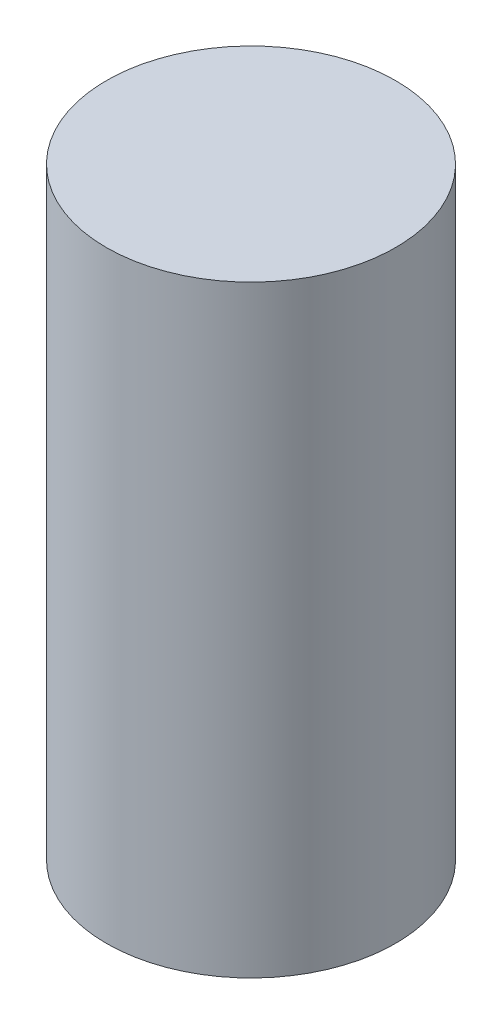
ISO-10303-21;
HEADER;
FILE_DESCRIPTION(('STEP AP214'),'2;1');
FILE_NAME('part.step','',(''),(''),'','','');
FILE_SCHEMA(('AUTOMOTIVE_DESIGN { 1 0 10303 214 1 1 1 1 }'));
ENDSEC;
DATA;
#1=APPLICATION_CONTEXT('core data for automotive mechanical design processes');
#2=APPLICATION_PROTOCOL_DEFINITION('international standard','automotive_design',2000,#1);
#3=PRODUCT_CONTEXT('',#1,'mechanical');
#4=PRODUCT('Part','Part','',(#3));
#5=PRODUCT_RELATED_PRODUCT_CATEGORY('part','',(#4));
#6=PRODUCT_DEFINITION_FORMATION('','',#4);
#7=PRODUCT_DEFINITION_CONTEXT('part definition',#1,'design');
#8=PRODUCT_DEFINITION('design','',#6,#7);
#9=PRODUCT_DEFINITION_SHAPE('','',#8);
#10=(LENGTH_UNIT() NAMED_UNIT(*) SI_UNIT(.MILLI.,.METRE.));
#11=(NAMED_UNIT(*) PLANE_ANGLE_UNIT() SI_UNIT($,.RADIAN.));
#12=(NAMED_UNIT(*) SI_UNIT($,.STERADIAN.) SOLID_ANGLE_UNIT());
#13=UNCERTAINTY_MEASURE_WITH_UNIT(LENGTH_MEASURE(1.E-05),#10,'distance_accuracy_value','');
#14=(GEOMETRIC_REPRESENTATION_CONTEXT(3) GLOBAL_UNCERTAINTY_ASSIGNED_CONTEXT((#13)) GLOBAL_UNIT_ASSIGNED_CONTEXT((#10,
#11,#12)) REPRESENTATION_CONTEXT('',''));
#15=CARTESIAN_POINT('',(0.,0.,0.));
#16=DIRECTION('',(0.,0.,1.));
#17=DIRECTION('',(1.,0.,0.));
#18=AXIS2_PLACEMENT_3D('',#15,#16,#17);
#19=CARTESIAN_POINT('',(0.,25.,0.));
#20=DIRECTION('',(0.,-1.,0.));
#21=DIRECTION('',(0.,0.,-1.));
#22=AXIS2_PLACEMENT_3D('',#19,#20,#21);
#23=CYLINDRICAL_SURFACE('',#22,6.);
#24=CARTESIAN_POINT('',(0.,25.,0.));
#25=DIRECTION('',(0.,1.,0.));
#26=DIRECTION('',(0.,0.,1.));
#27=AXIS2_PLACEMENT_3D('',#24,#25,#26);
#28=CIRCLE('',#27,6.);
#29=CARTESIAN_POINT('',(0.,25.,6.));
#30=VERTEX_POINT('',#29);
#31=EDGE_CURVE('E10',#30,#30,#28,.T.);
#32=ORIENTED_EDGE('',*,*,#31,.F.);
#33=EDGE_LOOP('',(#32));
#34=FACE_BOUND('',#33,.T.);
#35=CARTESIAN_POINT('',(0.,0.,0.));
#36=DIRECTION('',(0.,1.,0.));
#37=DIRECTION('',(0.,0.,1.));
#38=AXIS2_PLACEMENT_3D('',#35,#36,#37);
#39=CIRCLE('',#38,6.);
#40=CARTESIAN_POINT('',(0.,0.,6.));
#41=VERTEX_POINT('',#40);
#42=EDGE_CURVE('E44',#41,#41,#39,.T.);
#43=ORIENTED_EDGE('',*,*,#42,.T.);
#44=EDGE_LOOP('',(#43));
#45=FACE_BOUND('',#44,.T.);
#46=ADVANCED_FACE('F41',(#34,#45),#23,.T.);
#47=CARTESIAN_POINT('',(0.,25.,0.));
#48=DIRECTION('',(0.,1.,0.));
#49=DIRECTION('',(0.,0.,1.));
#50=AXIS2_PLACEMENT_3D('',#47,#48,#49);
#51=PLANE('',#50);
#52=ORIENTED_EDGE('',*,*,#31,.T.);
#53=EDGE_LOOP('',(#52));
#54=FACE_BOUND('',#53,.T.);
#55=ADVANCED_FACE('F56',(#54),#51,.T.);
#56=CARTESIAN_POINT('',(0.,0.,0.));
#57=DIRECTION('',(0.,1.,0.));
#58=DIRECTION('',(0.,0.,1.));
#59=AXIS2_PLACEMENT_3D('',#56,#57,#58);
#60=PLANE('',#59);
#61=ORIENTED_EDGE('',*,*,#42,.F.);
#62=EDGE_LOOP('',(#61));
#63=FACE_BOUND('',#62,.T.);
#64=ADVANCED_FACE('F54',(#63),#60,.F.);
#65=CLOSED_SHELL('',(#46,#55,#64));
#66=MANIFOLD_SOLID_BREP('B2',#65);
#67=ADVANCED_BREP_SHAPE_REPRESENTATION('',(#18,#66),#14);
#68=SHAPE_DEFINITION_REPRESENTATION(#9,#67);
ENDSEC;
END-ISO-10303-21;
